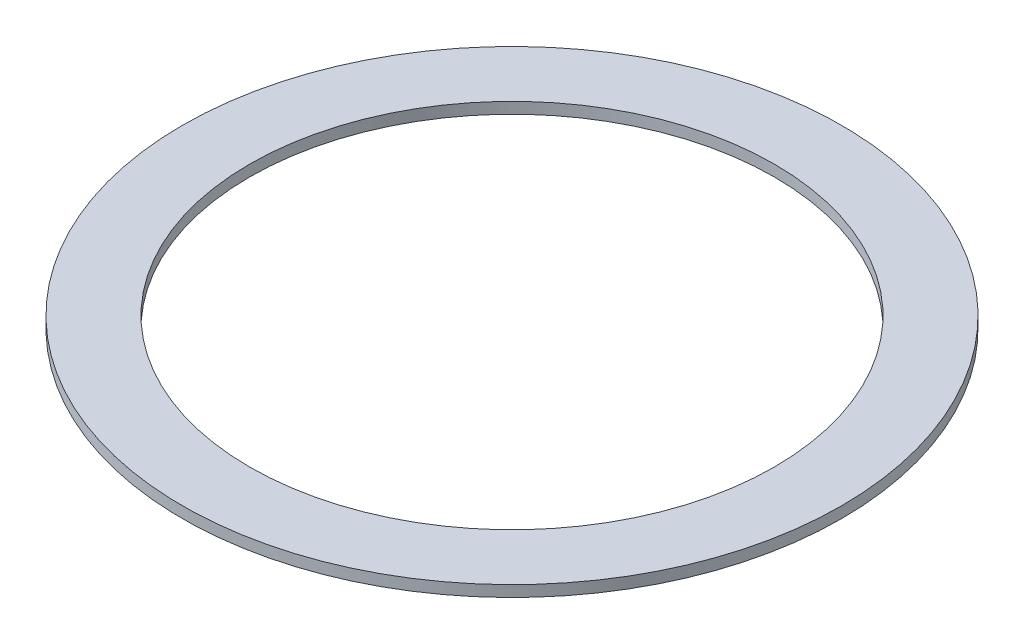
ISO-10303-21;
HEADER;
FILE_DESCRIPTION(('STEP AP214'),'2;1');
FILE_NAME('part.step','',(''),(''),'','','');
FILE_SCHEMA(('AUTOMOTIVE_DESIGN { 1 0 10303 214 1 1 1 1 }'));
ENDSEC;
DATA;
#1=APPLICATION_CONTEXT('core data for automotive mechanical design processes');
#2=APPLICATION_PROTOCOL_DEFINITION('international standard','automotive_design',2000,#1);
#3=PRODUCT_CONTEXT('',#1,'mechanical');
#4=PRODUCT('Part','Part','',(#3));
#5=PRODUCT_RELATED_PRODUCT_CATEGORY('part','',(#4));
#6=PRODUCT_DEFINITION_FORMATION('','',#4);
#7=PRODUCT_DEFINITION_CONTEXT('part definition',#1,'design');
#8=PRODUCT_DEFINITION('design','',#6,#7);
#9=PRODUCT_DEFINITION_SHAPE('','',#8);
#10=(LENGTH_UNIT() NAMED_UNIT(*) SI_UNIT(.MILLI.,.METRE.));
#11=(NAMED_UNIT(*) PLANE_ANGLE_UNIT() SI_UNIT($,.RADIAN.));
#12=(NAMED_UNIT(*) SI_UNIT($,.STERADIAN.) SOLID_ANGLE_UNIT());
#13=UNCERTAINTY_MEASURE_WITH_UNIT(LENGTH_MEASURE(1.E-05),#10,'distance_accuracy_value','');
#14=(GEOMETRIC_REPRESENTATION_CONTEXT(3) GLOBAL_UNCERTAINTY_ASSIGNED_CONTEXT((#13)) GLOBAL_UNIT_ASSIGNED_CONTEXT((#10,
#11,#12)) REPRESENTATION_CONTEXT('',''));
#15=CARTESIAN_POINT('',(0.,0.,0.));
#16=DIRECTION('',(0.,0.,1.));
#17=DIRECTION('',(1.,0.,0.));
#18=AXIS2_PLACEMENT_3D('',#15,#16,#17);
#19=CARTESIAN_POINT('',(0.,2.8,0.));
#20=DIRECTION('',(0.,1.,0.));
#21=DIRECTION('',(1.,0.,0.));
#22=AXIS2_PLACEMENT_3D('',#19,#20,#21);
#23=CYLINDRICAL_SURFACE('',#22,11.75);
#24=CARTESIAN_POINT('',(0.,3.3,0.));
#25=DIRECTION('',(0.,1.,0.));
#26=DIRECTION('',(-1.,0.,0.));
#27=AXIS2_PLACEMENT_3D('',#24,#25,#26);
#28=CIRCLE('',#27,11.75);
#29=CARTESIAN_POINT('',(-11.75,3.3,0.));
#30=VERTEX_POINT('',#29);
#31=EDGE_CURVE('E11',#30,#30,#28,.T.);
#32=ORIENTED_EDGE('',*,*,#31,.T.);
#33=EDGE_LOOP('',(#32));
#34=FACE_BOUND('',#33,.T.);
#35=CARTESIAN_POINT('',(0.,2.8,0.));
#36=DIRECTION('',(0.,-1.,0.));
#37=DIRECTION('',(1.,0.,0.));
#38=AXIS2_PLACEMENT_3D('',#35,#36,#37);
#39=CIRCLE('',#38,11.75);
#40=CARTESIAN_POINT('',(11.75,2.8,0.));
#41=VERTEX_POINT('',#40);
#42=EDGE_CURVE('E46',#41,#41,#39,.T.);
#43=ORIENTED_EDGE('',*,*,#42,.T.);
#44=EDGE_LOOP('',(#43));
#45=FACE_BOUND('',#44,.T.);
#46=ADVANCED_FACE('F17',(#34,#45),#23,.F.);
#47=CARTESIAN_POINT('',(0.,3.3,0.));
#48=DIRECTION('',(0.,1.,0.));
#49=DIRECTION('',(-1.,0.,0.));
#50=AXIS2_PLACEMENT_3D('',#47,#48,#49);
#51=PLANE('',#50);
#52=ORIENTED_EDGE('',*,*,#31,.F.);
#53=EDGE_LOOP('',(#52));
#54=FACE_BOUND('',#53,.T.);
#55=CARTESIAN_POINT('',(0.,3.3,0.));
#56=DIRECTION('',(0.,-1.,0.));
#57=DIRECTION('',(-1.,0.,0.));
#58=AXIS2_PLACEMENT_3D('',#55,#56,#57);
#59=CIRCLE('',#58,14.76);
#60=CARTESIAN_POINT('',(14.76,3.3,0.));
#61=VERTEX_POINT('',#60);
#62=EDGE_CURVE('E21',#61,#61,#59,.T.);
#63=ORIENTED_EDGE('',*,*,#62,.F.);
#64=EDGE_LOOP('',(#63));
#65=FACE_BOUND('',#64,.T.);
#66=ADVANCED_FACE('F19',(#54,#65),#51,.T.);
#67=CARTESIAN_POINT('',(0.,2.8,0.));
#68=DIRECTION('',(0.,1.,0.));
#69=DIRECTION('',(1.,0.,0.));
#70=AXIS2_PLACEMENT_3D('',#67,#68,#69);
#71=CYLINDRICAL_SURFACE('',#70,14.76);
#72=ORIENTED_EDGE('',*,*,#62,.T.);
#73=EDGE_LOOP('',(#72));
#74=FACE_BOUND('',#73,.T.);
#75=CARTESIAN_POINT('',(0.,2.8,0.));
#76=DIRECTION('',(0.,1.,0.));
#77=DIRECTION('',(1.,0.,0.));
#78=AXIS2_PLACEMENT_3D('',#75,#76,#77);
#79=CIRCLE('',#78,14.76);
#80=CARTESIAN_POINT('',(14.76,2.8,0.));
#81=VERTEX_POINT('',#80);
#82=EDGE_CURVE('E53',#81,#81,#79,.T.);
#83=ORIENTED_EDGE('',*,*,#82,.T.);
#84=EDGE_LOOP('',(#83));
#85=FACE_BOUND('',#84,.T.);
#86=ADVANCED_FACE('F54',(#74,#85),#71,.T.);
#87=CARTESIAN_POINT('',(0.,2.8,0.));
#88=DIRECTION('',(0.,1.,0.));
#89=DIRECTION('',(-1.,0.,0.));
#90=AXIS2_PLACEMENT_3D('',#87,#88,#89);
#91=PLANE('',#90);
#92=ORIENTED_EDGE('',*,*,#42,.F.);
#93=EDGE_LOOP('',(#92));
#94=FACE_BOUND('',#93,.T.);
#95=ORIENTED_EDGE('',*,*,#82,.F.);
#96=EDGE_LOOP('',(#95));
#97=FACE_BOUND('',#96,.T.);
#98=ADVANCED_FACE('F74',(#94,#97),#91,.F.);
#99=CLOSED_SHELL('',(#46,#66,#86,#98));
#100=MANIFOLD_SOLID_BREP('B1',#99);
#101=ADVANCED_BREP_SHAPE_REPRESENTATION('',(#18,#100),#14);
#102=SHAPE_DEFINITION_REPRESENTATION(#9,#101);
ENDSEC;
END-ISO-10303-21;
